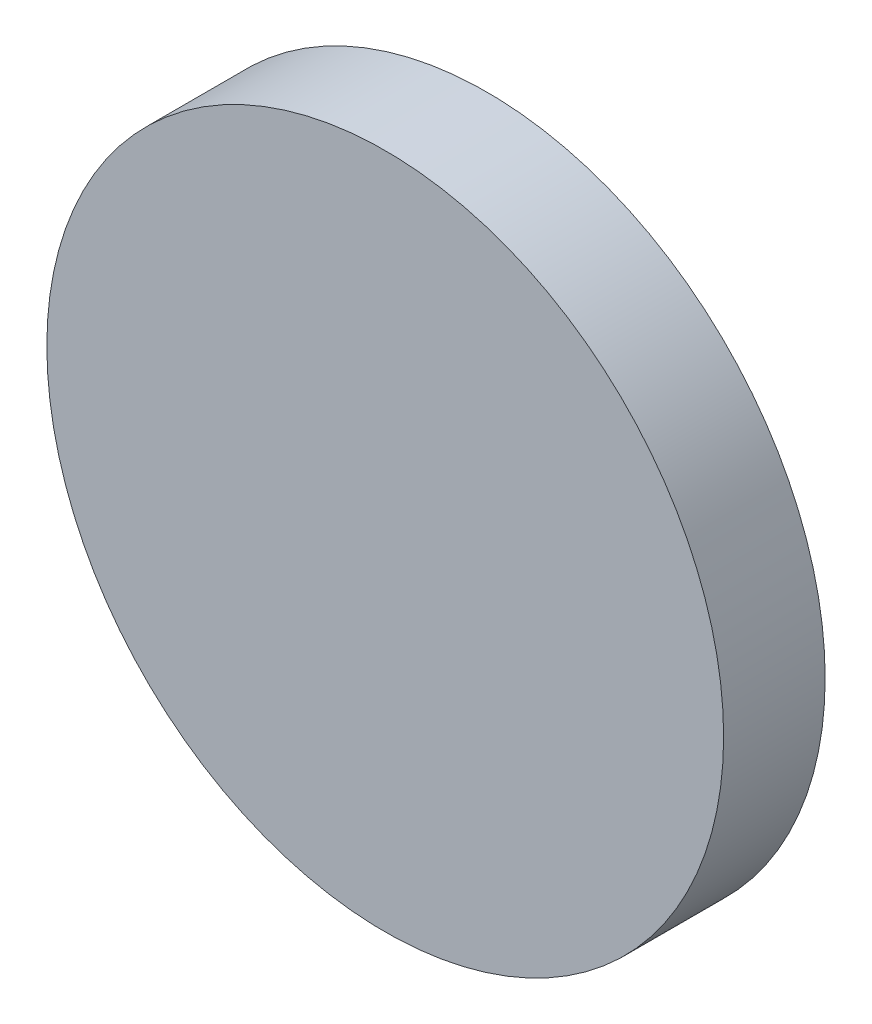
ISO-10303-21;
HEADER;
FILE_DESCRIPTION(('STEP AP214'),'2;1');
FILE_NAME('part.step','',(''),(''),'','','');
FILE_SCHEMA(('AUTOMOTIVE_DESIGN { 1 0 10303 214 1 1 1 1 }'));
ENDSEC;
DATA;
#1=APPLICATION_CONTEXT('core data for automotive mechanical design processes');
#2=APPLICATION_PROTOCOL_DEFINITION('international standard','automotive_design',2000,#1);
#3=PRODUCT_CONTEXT('',#1,'mechanical');
#4=PRODUCT('Part','Part','',(#3));
#5=PRODUCT_RELATED_PRODUCT_CATEGORY('part','',(#4));
#6=PRODUCT_DEFINITION_FORMATION('','',#4);
#7=PRODUCT_DEFINITION_CONTEXT('part definition',#1,'design');
#8=PRODUCT_DEFINITION('design','',#6,#7);
#9=PRODUCT_DEFINITION_SHAPE('','',#8);
#10=(LENGTH_UNIT() NAMED_UNIT(*) SI_UNIT(.MILLI.,.METRE.));
#11=(NAMED_UNIT(*) PLANE_ANGLE_UNIT() SI_UNIT($,.RADIAN.));
#12=(NAMED_UNIT(*) SI_UNIT($,.STERADIAN.) SOLID_ANGLE_UNIT());
#13=UNCERTAINTY_MEASURE_WITH_UNIT(LENGTH_MEASURE(1.E-05),#10,'distance_accuracy_value','');
#14=(GEOMETRIC_REPRESENTATION_CONTEXT(3) GLOBAL_UNCERTAINTY_ASSIGNED_CONTEXT((#13)) GLOBAL_UNIT_ASSIGNED_CONTEXT((#10,
#11,#12)) REPRESENTATION_CONTEXT('',''));
#15=CARTESIAN_POINT('',(0.,0.,0.));
#16=DIRECTION('',(0.,0.,1.));
#17=DIRECTION('',(1.,0.,0.));
#18=AXIS2_PLACEMENT_3D('',#15,#16,#17);
#19=CARTESIAN_POINT('',(0.,0.,15.));
#20=DIRECTION('',(0.,0.,-1.));
#21=DIRECTION('',(-1.,0.,0.));
#22=AXIS2_PLACEMENT_3D('',#19,#20,#21);
#23=CYLINDRICAL_SURFACE('',#22,100.);
#24=CARTESIAN_POINT('',(0.,0.,15.));
#25=DIRECTION('',(0.,0.,1.));
#26=DIRECTION('',(1.,0.,0.));
#27=AXIS2_PLACEMENT_3D('',#24,#25,#26);
#28=CIRCLE('',#27,100.);
#29=CARTESIAN_POINT('',(100.,0.,15.));
#30=VERTEX_POINT('',#29);
#31=EDGE_CURVE('E10',#30,#30,#28,.T.);
#32=ORIENTED_EDGE('',*,*,#31,.F.);
#33=EDGE_LOOP('',(#32));
#34=FACE_BOUND('',#33,.T.);
#35=CARTESIAN_POINT('',(0.,0.,-15.));
#36=DIRECTION('',(0.,0.,1.));
#37=DIRECTION('',(1.,0.,0.));
#38=AXIS2_PLACEMENT_3D('',#35,#36,#37);
#39=CIRCLE('',#38,100.);
#40=CARTESIAN_POINT('',(100.,0.,-15.));
#41=VERTEX_POINT('',#40);
#42=EDGE_CURVE('E40',#41,#41,#39,.T.);
#43=ORIENTED_EDGE('',*,*,#42,.T.);
#44=EDGE_LOOP('',(#43));
#45=FACE_BOUND('',#44,.T.);
#46=ADVANCED_FACE('F37',(#34,#45),#23,.T.);
#47=CARTESIAN_POINT('',(0.,0.,15.));
#48=DIRECTION('',(0.,0.,1.));
#49=DIRECTION('',(1.,0.,0.));
#50=AXIS2_PLACEMENT_3D('',#47,#48,#49);
#51=PLANE('',#50);
#52=ORIENTED_EDGE('',*,*,#31,.T.);
#53=EDGE_LOOP('',(#52));
#54=FACE_BOUND('',#53,.T.);
#55=ADVANCED_FACE('F54',(#54),#51,.T.);
#56=CARTESIAN_POINT('',(0.,0.,-15.));
#57=DIRECTION('',(0.,0.,1.));
#58=DIRECTION('',(1.,0.,0.));
#59=AXIS2_PLACEMENT_3D('',#56,#57,#58);
#60=PLANE('',#59);
#61=ORIENTED_EDGE('',*,*,#42,.F.);
#62=EDGE_LOOP('',(#61));
#63=FACE_BOUND('',#62,.T.);
#64=ADVANCED_FACE('F52',(#63),#60,.F.);
#65=CLOSED_SHELL('',(#46,#55,#64));
#66=MANIFOLD_SOLID_BREP('B2',#65);
#67=ADVANCED_BREP_SHAPE_REPRESENTATION('',(#18,#66),#14);
#68=SHAPE_DEFINITION_REPRESENTATION(#9,#67);
ENDSEC;
END-ISO-10303-21;
